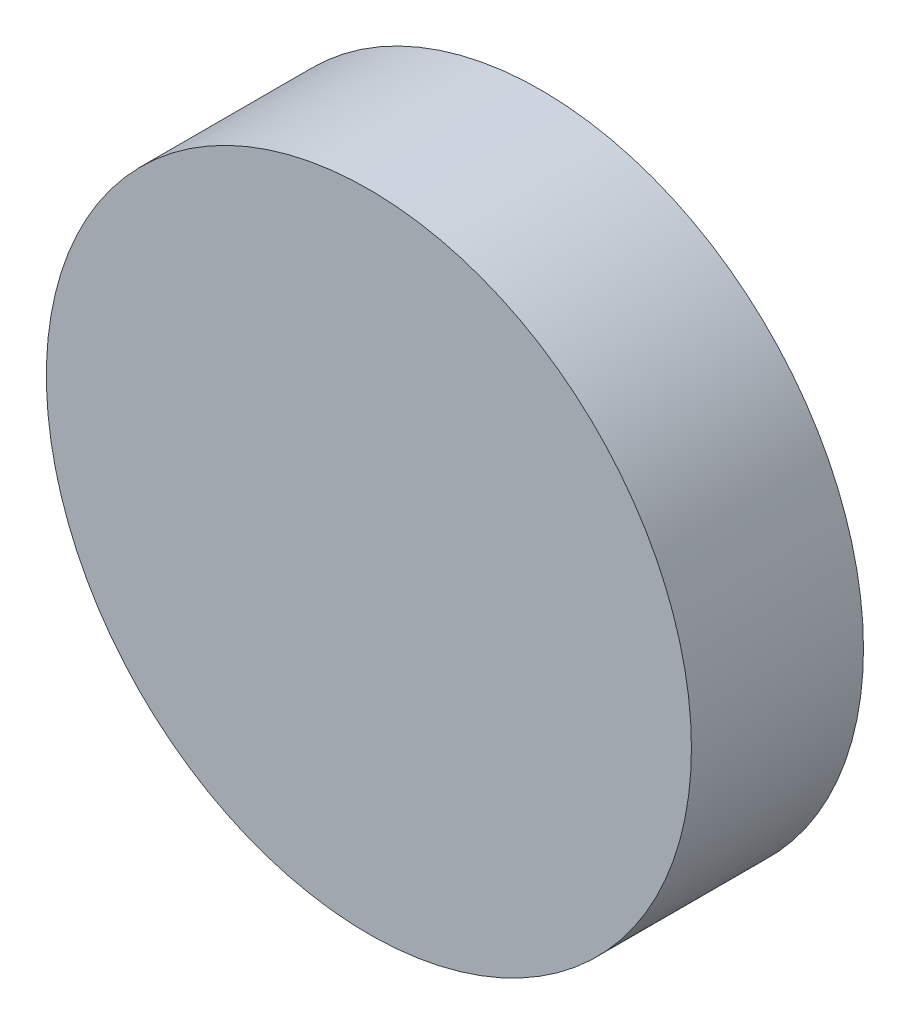
ISO-10303-21;
HEADER;
FILE_DESCRIPTION(('STEP AP214'),'2;1');
FILE_NAME('part.step','',(''),(''),'','','');
FILE_SCHEMA(('AUTOMOTIVE_DESIGN { 1 0 10303 214 1 1 1 1 }'));
ENDSEC;
DATA;
#1=APPLICATION_CONTEXT('core data for automotive mechanical design processes');
#2=APPLICATION_PROTOCOL_DEFINITION('international standard','automotive_design',2000,#1);
#3=PRODUCT_CONTEXT('',#1,'mechanical');
#4=PRODUCT('Part','Part','',(#3));
#5=PRODUCT_RELATED_PRODUCT_CATEGORY('part','',(#4));
#6=PRODUCT_DEFINITION_FORMATION('','',#4);
#7=PRODUCT_DEFINITION_CONTEXT('part definition',#1,'design');
#8=PRODUCT_DEFINITION('design','',#6,#7);
#9=PRODUCT_DEFINITION_SHAPE('','',#8);
#10=(LENGTH_UNIT() NAMED_UNIT(*) SI_UNIT(.MILLI.,.METRE.));
#11=(NAMED_UNIT(*) PLANE_ANGLE_UNIT() SI_UNIT($,.RADIAN.));
#12=(NAMED_UNIT(*) SI_UNIT($,.STERADIAN.) SOLID_ANGLE_UNIT());
#13=UNCERTAINTY_MEASURE_WITH_UNIT(LENGTH_MEASURE(1.E-05),#10,'distance_accuracy_value','');
#14=(GEOMETRIC_REPRESENTATION_CONTEXT(3) GLOBAL_UNCERTAINTY_ASSIGNED_CONTEXT((#13)) GLOBAL_UNIT_ASSIGNED_CONTEXT((#10,
#11,#12)) REPRESENTATION_CONTEXT('',''));
#15=CARTESIAN_POINT('',(0.,0.,0.));
#16=DIRECTION('',(0.,0.,1.));
#17=DIRECTION('',(1.,0.,0.));
#18=AXIS2_PLACEMENT_3D('',#15,#16,#17);
#19=CARTESIAN_POINT('',(0.,0.,4.));
#20=DIRECTION('',(0.,0.,-1.));
#21=DIRECTION('',(-1.,0.,0.));
#22=AXIS2_PLACEMENT_3D('',#19,#20,#21);
#23=CYLINDRICAL_SURFACE('',#22,7.5);
#24=CARTESIAN_POINT('',(0.,0.,4.));
#25=DIRECTION('',(0.,0.,1.));
#26=DIRECTION('',(1.,0.,0.));
#27=AXIS2_PLACEMENT_3D('',#24,#25,#26);
#28=CIRCLE('',#27,7.5);
#29=CARTESIAN_POINT('',(7.5,0.,4.));
#30=VERTEX_POINT('',#29);
#31=EDGE_CURVE('E10',#30,#30,#28,.T.);
#32=ORIENTED_EDGE('',*,*,#31,.F.);
#33=EDGE_LOOP('',(#32));
#34=FACE_BOUND('',#33,.T.);
#35=CARTESIAN_POINT('',(0.,0.,0.));
#36=DIRECTION('',(0.,0.,1.));
#37=DIRECTION('',(1.,0.,0.));
#38=AXIS2_PLACEMENT_3D('',#35,#36,#37);
#39=CIRCLE('',#38,7.5);
#40=CARTESIAN_POINT('',(7.5,0.,0.));
#41=VERTEX_POINT('',#40);
#42=EDGE_CURVE('E50',#41,#41,#39,.T.);
#43=ORIENTED_EDGE('',*,*,#42,.T.);
#44=EDGE_LOOP('',(#43));
#45=FACE_BOUND('',#44,.T.);
#46=ADVANCED_FACE('F47',(#34,#45),#23,.T.);
#47=CARTESIAN_POINT('',(0.,0.,4.));
#48=DIRECTION('',(0.,0.,1.));
#49=DIRECTION('',(1.,0.,0.));
#50=AXIS2_PLACEMENT_3D('',#47,#48,#49);
#51=PLANE('',#50);
#52=ORIENTED_EDGE('',*,*,#31,.T.);
#53=EDGE_LOOP('',(#52));
#54=FACE_BOUND('',#53,.T.);
#55=ADVANCED_FACE('F64',(#54),#51,.T.);
#56=CARTESIAN_POINT('',(0.,0.,0.));
#57=DIRECTION('',(0.,0.,1.));
#58=DIRECTION('',(1.,0.,0.));
#59=AXIS2_PLACEMENT_3D('',#56,#57,#58);
#60=PLANE('',#59);
#61=ORIENTED_EDGE('',*,*,#42,.F.);
#62=EDGE_LOOP('',(#61));
#63=FACE_BOUND('',#62,.T.);
#64=ADVANCED_FACE('F62',(#63),#60,.F.);
#65=CLOSED_SHELL('',(#46,#55,#64));
#66=MANIFOLD_SOLID_BREP('B2',#65);
#67=ADVANCED_BREP_SHAPE_REPRESENTATION('',(#18,#66),#14);
#68=SHAPE_DEFINITION_REPRESENTATION(#9,#67);
ENDSEC;
END-ISO-10303-21;
